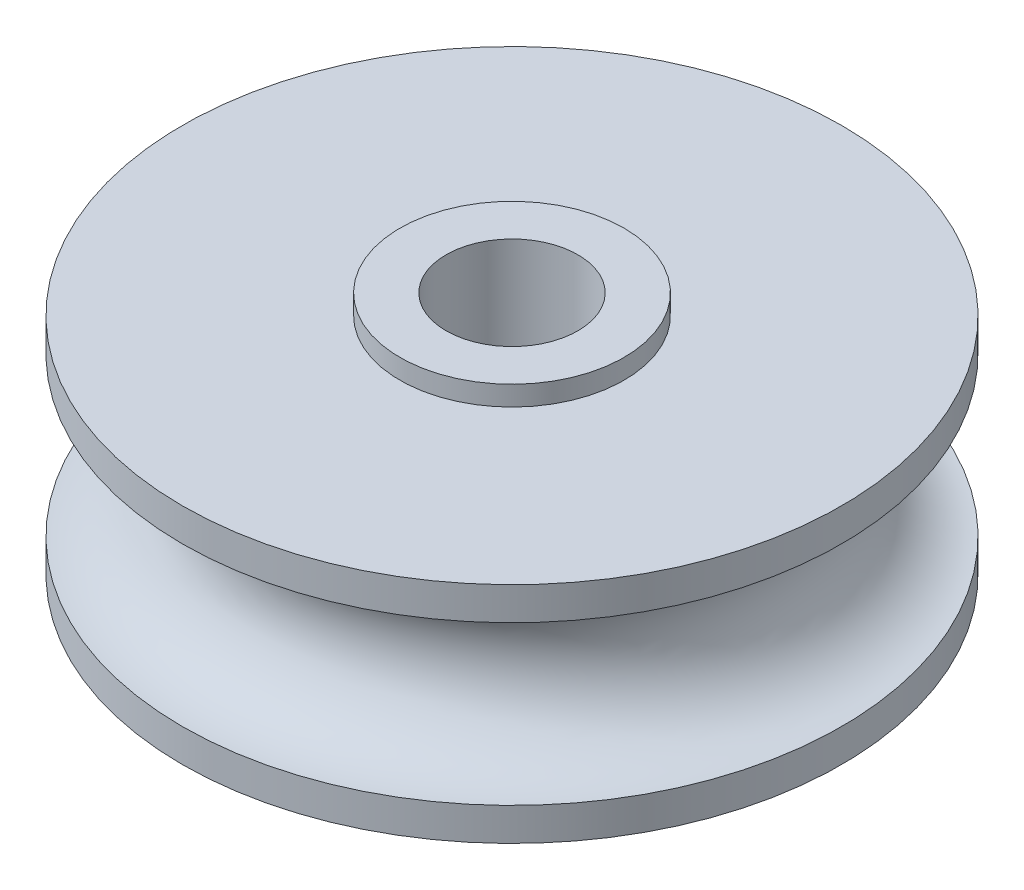
ISO-10303-21;
HEADER;
FILE_DESCRIPTION(('STEP AP214'),'2;1');
FILE_NAME('part.step','',(''),(''),'','','');
FILE_SCHEMA(('AUTOMOTIVE_DESIGN { 1 0 10303 214 1 1 1 1 }'));
ENDSEC;
DATA;
#1=APPLICATION_CONTEXT('core data for automotive mechanical design processes');
#2=APPLICATION_PROTOCOL_DEFINITION('international standard','automotive_design',2000,#1);
#3=PRODUCT_CONTEXT('',#1,'mechanical');
#4=PRODUCT('Part','Part','',(#3));
#5=PRODUCT_RELATED_PRODUCT_CATEGORY('part','',(#4));
#6=PRODUCT_DEFINITION_FORMATION('','',#4);
#7=PRODUCT_DEFINITION_CONTEXT('part definition',#1,'design');
#8=PRODUCT_DEFINITION('design','',#6,#7);
#9=PRODUCT_DEFINITION_SHAPE('','',#8);
#10=(LENGTH_UNIT() NAMED_UNIT(*) SI_UNIT(.MILLI.,.METRE.));
#11=(NAMED_UNIT(*) PLANE_ANGLE_UNIT() SI_UNIT($,.RADIAN.));
#12=(NAMED_UNIT(*) SI_UNIT($,.STERADIAN.) SOLID_ANGLE_UNIT());
#13=UNCERTAINTY_MEASURE_WITH_UNIT(LENGTH_MEASURE(1.E-05),#10,'distance_accuracy_value','');
#14=(GEOMETRIC_REPRESENTATION_CONTEXT(3) GLOBAL_UNCERTAINTY_ASSIGNED_CONTEXT((#13)) GLOBAL_UNIT_ASSIGNED_CONTEXT((#10,
#11,#12)) REPRESENTATION_CONTEXT('',''));
#15=CARTESIAN_POINT('',(0.,0.,0.));
#16=DIRECTION('',(0.,0.,1.));
#17=DIRECTION('',(1.,0.,0.));
#18=AXIS2_PLACEMENT_3D('',#15,#16,#17);
#19=CARTESIAN_POINT('',(4.318,0.,0.));
#20=DIRECTION('',(0.,-1.,0.));
#21=DIRECTION('',(0.,0.,-1.));
#22=AXIS2_PLACEMENT_3D('',#19,#20,#21);
#23=PLANE('',#22);
#24=CARTESIAN_POINT('',(0.,0.,0.));
#25=DIRECTION('',(0.,1.,0.));
#26=DIRECTION('',(0.,0.,1.));
#27=AXIS2_PLACEMENT_3D('',#24,#25,#26);
#28=CIRCLE('',#27,2.54);
#29=CARTESIAN_POINT('',(0.,0.,2.54));
#30=VERTEX_POINT('',#29);
#31=EDGE_CURVE('E76',#30,#30,#28,.T.);
#32=ORIENTED_EDGE('',*,*,#31,.T.);
#33=EDGE_LOOP('',(#32));
#34=FACE_BOUND('',#33,.T.);
#35=CARTESIAN_POINT('',(0.,0.,0.));
#36=DIRECTION('',(0.,-1.,0.));
#37=DIRECTION('',(0.,0.,-1.));
#38=AXIS2_PLACEMENT_3D('',#35,#36,#37);
#39=CIRCLE('',#38,4.318);
#40=CARTESIAN_POINT('',(0.,0.,-4.318));
#41=VERTEX_POINT('',#40);
#42=EDGE_CURVE('E10',#41,#41,#39,.T.);
#43=ORIENTED_EDGE('',*,*,#42,.T.);
#44=EDGE_LOOP('',(#43));
#45=FACE_BOUND('',#44,.T.);
#46=ADVANCED_FACE('F37',(#34,#45),#23,.T.);
#47=CARTESIAN_POINT('',(0.,0.,0.));
#48=DIRECTION('',(0.,-1.,0.));
#49=DIRECTION('',(0.,0.,-1.));
#50=AXIS2_PLACEMENT_3D('',#47,#48,#49);
#51=CYLINDRICAL_SURFACE('',#50,4.318);
#52=CARTESIAN_POINT('',(0.,0.762,0.));
#53=DIRECTION('',(0.,-1.,0.));
#54=DIRECTION('',(0.,0.,-1.));
#55=AXIS2_PLACEMENT_3D('',#52,#53,#54);
#56=CIRCLE('',#55,4.318);
#57=CARTESIAN_POINT('',(0.,0.762,-4.318));
#58=VERTEX_POINT('',#57);
#59=EDGE_CURVE('E44',#58,#58,#56,.T.);
#60=ORIENTED_EDGE('',*,*,#59,.T.);
#61=EDGE_LOOP('',(#60));
#62=FACE_BOUND('',#61,.T.);
#63=ORIENTED_EDGE('',*,*,#42,.F.);
#64=EDGE_LOOP('',(#63));
#65=FACE_BOUND('',#64,.T.);
#66=ADVANCED_FACE('F131',(#62,#65),#51,.T.);
#67=CARTESIAN_POINT('',(12.7,0.762,0.));
#68=DIRECTION('',(0.,-1.,0.));
#69=DIRECTION('',(0.,0.,-1.));
#70=AXIS2_PLACEMENT_3D('',#67,#68,#69);
#71=PLANE('',#70);
#72=CARTESIAN_POINT('',(0.,0.762,0.));
#73=DIRECTION('',(0.,-1.,0.));
#74=DIRECTION('',(0.,0.,-1.));
#75=AXIS2_PLACEMENT_3D('',#72,#73,#74);
#76=CIRCLE('',#75,12.7);
#77=CARTESIAN_POINT('',(0.,0.762,-12.7));
#78=VERTEX_POINT('',#77);
#79=EDGE_CURVE('E49',#78,#78,#76,.T.);
#80=ORIENTED_EDGE('',*,*,#79,.T.);
#81=EDGE_LOOP('',(#80));
#82=FACE_BOUND('',#81,.T.);
#83=ORIENTED_EDGE('',*,*,#59,.F.);
#84=EDGE_LOOP('',(#83));
#85=FACE_BOUND('',#84,.T.);
#86=ADVANCED_FACE('F125',(#82,#85),#71,.T.);
#87=CARTESIAN_POINT('',(0.,0.,0.));
#88=DIRECTION('',(0.,-1.,0.));
#89=DIRECTION('',(0.,0.,-1.));
#90=AXIS2_PLACEMENT_3D('',#87,#88,#89);
#91=CYLINDRICAL_SURFACE('',#90,12.7);
#92=CARTESIAN_POINT('',(0.,2.032,0.));
#93=DIRECTION('',(0.,-1.,0.));
#94=DIRECTION('',(0.,0.,-1.));
#95=AXIS2_PLACEMENT_3D('',#92,#93,#94);
#96=CIRCLE('',#95,12.7);
#97=CARTESIAN_POINT('',(0.,2.032,-12.7));
#98=VERTEX_POINT('',#97);
#99=EDGE_CURVE('E54',#98,#98,#96,.T.);
#100=ORIENTED_EDGE('',*,*,#99,.T.);
#101=EDGE_LOOP('',(#100));
#102=FACE_BOUND('',#101,.T.);
#103=ORIENTED_EDGE('',*,*,#79,.F.);
#104=EDGE_LOOP('',(#103));
#105=FACE_BOUND('',#104,.T.);
#106=ADVANCED_FACE('F119',(#102,#105),#91,.T.);
#107=CARTESIAN_POINT('',(0.,5.08,0.));
#108=DIRECTION('',(0.,-1.,0.));
#109=DIRECTION('',(0.,0.,-1.));
#110=AXIS2_PLACEMENT_3D('',#107,#108,#109);
#111=TOROIDAL_SURFACE('',#110,12.7,3.048);
#112=CARTESIAN_POINT('',(0.,8.128,0.));
#113=DIRECTION('',(0.,-1.,0.));
#114=DIRECTION('',(0.,0.,-1.));
#115=AXIS2_PLACEMENT_3D('',#112,#113,#114);
#116=CIRCLE('',#115,12.7);
#117=CARTESIAN_POINT('',(0.,8.128,-12.7));
#118=VERTEX_POINT('',#117);
#119=EDGE_CURVE('E60',#118,#118,#116,.T.);
#120=ORIENTED_EDGE('',*,*,#119,.T.);
#121=EDGE_LOOP('',(#120));
#122=FACE_BOUND('',#121,.T.);
#123=ORIENTED_EDGE('',*,*,#99,.F.);
#124=EDGE_LOOP('',(#123));
#125=FACE_BOUND('',#124,.T.);
#126=ADVANCED_FACE('F113',(#122,#125),#111,.F.);
#127=CARTESIAN_POINT('',(0.,0.,0.));
#128=DIRECTION('',(0.,-1.,0.));
#129=DIRECTION('',(0.,0.,-1.));
#130=AXIS2_PLACEMENT_3D('',#127,#128,#129);
#131=CYLINDRICAL_SURFACE('',#130,12.7);
#132=CARTESIAN_POINT('',(0.,9.398,0.));
#133=DIRECTION('',(0.,-1.,0.));
#134=DIRECTION('',(0.,0.,-1.));
#135=AXIS2_PLACEMENT_3D('',#132,#133,#134);
#136=CIRCLE('',#135,12.7);
#137=CARTESIAN_POINT('',(0.,9.398,-12.7));
#138=VERTEX_POINT('',#137);
#139=EDGE_CURVE('E64',#138,#138,#136,.T.);
#140=ORIENTED_EDGE('',*,*,#139,.T.);
#141=EDGE_LOOP('',(#140));
#142=FACE_BOUND('',#141,.T.);
#143=ORIENTED_EDGE('',*,*,#119,.F.);
#144=EDGE_LOOP('',(#143));
#145=FACE_BOUND('',#144,.T.);
#146=ADVANCED_FACE('F107',(#142,#145),#131,.T.);
#147=CARTESIAN_POINT('',(4.318,9.398,0.));
#148=DIRECTION('',(0.,1.,0.));
#149=DIRECTION('',(0.,0.,1.));
#150=AXIS2_PLACEMENT_3D('',#147,#148,#149);
#151=PLANE('',#150);
#152=CARTESIAN_POINT('',(0.,9.398,0.));
#153=DIRECTION('',(0.,-1.,0.));
#154=DIRECTION('',(0.,0.,-1.));
#155=AXIS2_PLACEMENT_3D('',#152,#153,#154);
#156=CIRCLE('',#155,4.318);
#157=CARTESIAN_POINT('',(0.,9.398,-4.318));
#158=VERTEX_POINT('',#157);
#159=EDGE_CURVE('E68',#158,#158,#156,.T.);
#160=ORIENTED_EDGE('',*,*,#159,.T.);
#161=EDGE_LOOP('',(#160));
#162=FACE_BOUND('',#161,.T.);
#163=ORIENTED_EDGE('',*,*,#139,.F.);
#164=EDGE_LOOP('',(#163));
#165=FACE_BOUND('',#164,.T.);
#166=ADVANCED_FACE('F101',(#162,#165),#151,.T.);
#167=CARTESIAN_POINT('',(0.,0.,0.));
#168=DIRECTION('',(0.,-1.,0.));
#169=DIRECTION('',(0.,0.,-1.));
#170=AXIS2_PLACEMENT_3D('',#167,#168,#169);
#171=CYLINDRICAL_SURFACE('',#170,4.318);
#172=CARTESIAN_POINT('',(0.,10.16,0.));
#173=DIRECTION('',(0.,-1.,0.));
#174=DIRECTION('',(0.,0.,-1.));
#175=AXIS2_PLACEMENT_3D('',#172,#173,#174);
#176=CIRCLE('',#175,4.318);
#177=CARTESIAN_POINT('',(0.,10.16,-4.318));
#178=VERTEX_POINT('',#177);
#179=EDGE_CURVE('E72',#178,#178,#176,.T.);
#180=ORIENTED_EDGE('',*,*,#179,.T.);
#181=EDGE_LOOP('',(#180));
#182=FACE_BOUND('',#181,.T.);
#183=ORIENTED_EDGE('',*,*,#159,.F.);
#184=EDGE_LOOP('',(#183));
#185=FACE_BOUND('',#184,.T.);
#186=ADVANCED_FACE('F95',(#182,#185),#171,.T.);
#187=CARTESIAN_POINT('',(0.,10.16,0.));
#188=DIRECTION('',(0.,1.,0.));
#189=DIRECTION('',(0.,0.,1.));
#190=AXIS2_PLACEMENT_3D('',#187,#188,#189);
#191=PLANE('',#190);
#192=CARTESIAN_POINT('',(0.,10.16,0.));
#193=DIRECTION('',(0.,1.,0.));
#194=DIRECTION('',(0.,0.,1.));
#195=AXIS2_PLACEMENT_3D('',#192,#193,#194);
#196=CIRCLE('',#195,2.54);
#197=CARTESIAN_POINT('',(0.,10.16,2.54));
#198=VERTEX_POINT('',#197);
#199=EDGE_CURVE('E77',#198,#198,#196,.T.);
#200=ORIENTED_EDGE('',*,*,#199,.F.);
#201=EDGE_LOOP('',(#200));
#202=FACE_BOUND('',#201,.T.);
#203=ORIENTED_EDGE('',*,*,#179,.F.);
#204=EDGE_LOOP('',(#203));
#205=FACE_BOUND('',#204,.T.);
#206=ADVANCED_FACE('F89',(#202,#205),#191,.T.);
#207=CARTESIAN_POINT('',(0.,0.,0.));
#208=DIRECTION('',(0.,1.,0.));
#209=DIRECTION('',(0.,0.,1.));
#210=AXIS2_PLACEMENT_3D('',#207,#208,#209);
#211=CYLINDRICAL_SURFACE('',#210,2.54);
#212=ORIENTED_EDGE('',*,*,#31,.F.);
#213=EDGE_LOOP('',(#212));
#214=FACE_BOUND('',#213,.T.);
#215=ORIENTED_EDGE('',*,*,#199,.T.);
#216=EDGE_LOOP('',(#215));
#217=FACE_BOUND('',#216,.T.);
#218=ADVANCED_FACE('F86',(#214,#217),#211,.F.);
#219=CLOSED_SHELL('',(#46,#66,#86,#106,#126,#146,#166,#186,#206,#218));
#220=MANIFOLD_SOLID_BREP('B2',#219);
#221=ADVANCED_BREP_SHAPE_REPRESENTATION('',(#18,#220),#14);
#222=SHAPE_DEFINITION_REPRESENTATION(#9,#221);
ENDSEC;
END-ISO-10303-21;
